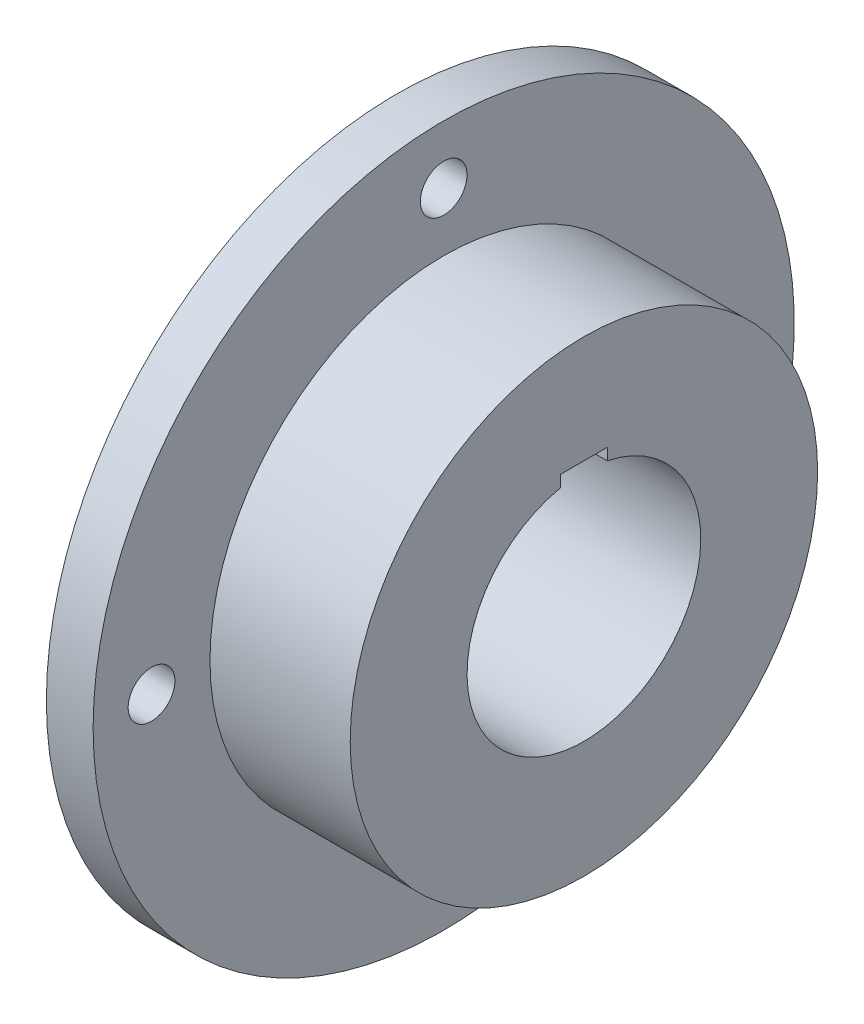
ISO-10303-21;
HEADER;
FILE_DESCRIPTION(('STEP AP214'),'2;1');
FILE_NAME('part.step','',(''),(''),'','','');
FILE_SCHEMA(('AUTOMOTIVE_DESIGN { 1 0 10303 214 1 1 1 1 }'));
ENDSEC;
DATA;
#1=APPLICATION_CONTEXT('core data for automotive mechanical design processes');
#2=APPLICATION_PROTOCOL_DEFINITION('international standard','automotive_design',2000,#1);
#3=PRODUCT_CONTEXT('',#1,'mechanical');
#4=PRODUCT('Part','Part','',(#3));
#5=PRODUCT_RELATED_PRODUCT_CATEGORY('part','',(#4));
#6=PRODUCT_DEFINITION_FORMATION('','',#4);
#7=PRODUCT_DEFINITION_CONTEXT('part definition',#1,'design');
#8=PRODUCT_DEFINITION('design','',#6,#7);
#9=PRODUCT_DEFINITION_SHAPE('','',#8);
#10=(LENGTH_UNIT() NAMED_UNIT(*) SI_UNIT(.MILLI.,.METRE.));
#11=(NAMED_UNIT(*) PLANE_ANGLE_UNIT() SI_UNIT($,.RADIAN.));
#12=(NAMED_UNIT(*) SI_UNIT($,.STERADIAN.) SOLID_ANGLE_UNIT());
#13=UNCERTAINTY_MEASURE_WITH_UNIT(LENGTH_MEASURE(1.E-05),#10,'distance_accuracy_value','');
#14=(GEOMETRIC_REPRESENTATION_CONTEXT(3) GLOBAL_UNCERTAINTY_ASSIGNED_CONTEXT((#13)) GLOBAL_UNIT_ASSIGNED_CONTEXT((#10,
#11,#12)) REPRESENTATION_CONTEXT('',''));
#15=CARTESIAN_POINT('',(0.,0.,0.));
#16=DIRECTION('',(0.,0.,1.));
#17=DIRECTION('',(1.,0.,0.));
#18=AXIS2_PLACEMENT_3D('',#15,#16,#17);
#19=CARTESIAN_POINT('',(7.,0.,0.));
#20=DIRECTION('',(-1.,0.,0.));
#21=DIRECTION('',(0.,0.,1.));
#22=AXIS2_PLACEMENT_3D('',#19,#20,#21);
#23=CYLINDRICAL_SURFACE('',#22,20.);
#24=CARTESIAN_POINT('',(7.,0.,0.));
#25=DIRECTION('',(1.,0.,0.));
#26=DIRECTION('',(0.,0.,-1.));
#27=AXIS2_PLACEMENT_3D('',#24,#25,#26);
#28=CIRCLE('',#27,20.);
#29=CARTESIAN_POINT('',(7.,0.,-20.));
#30=VERTEX_POINT('',#29);
#31=EDGE_CURVE('E43',#30,#30,#28,.T.);
#32=ORIENTED_EDGE('',*,*,#31,.F.);
#33=EDGE_LOOP('',(#32));
#34=FACE_BOUND('',#33,.T.);
#35=CARTESIAN_POINT('',(-5.,0.,0.));
#36=DIRECTION('',(-1.,0.,0.));
#37=DIRECTION('',(0.,0.,1.));
#38=AXIS2_PLACEMENT_3D('',#35,#36,#37);
#39=CIRCLE('',#38,20.);
#40=CARTESIAN_POINT('',(-5.,0.,20.));
#41=VERTEX_POINT('',#40);
#42=EDGE_CURVE('E11',#41,#41,#39,.T.);
#43=ORIENTED_EDGE('',*,*,#42,.F.);
#44=EDGE_LOOP('',(#43));
#45=FACE_BOUND('',#44,.T.);
#46=ADVANCED_FACE('F40',(#34,#45),#23,.T.);
#47=CARTESIAN_POINT('',(7.,0.,0.));
#48=DIRECTION('',(1.,0.,0.));
#49=DIRECTION('',(0.,0.,-1.));
#50=AXIS2_PLACEMENT_3D('',#47,#48,#49);
#51=PLANE('',#50);
#52=DIRECTION('',(0.,-1.,0.));
#53=VECTOR('',#52,1.);
#54=CARTESIAN_POINT('',(7.,0.,2.));
#55=LINE('',#54,#53);
#56=CARTESIAN_POINT('',(7.,10.7979589711327,2.));
#57=VERTEX_POINT('',#56);
#58=CARTESIAN_POINT('',(7.,9.79795897113271,2.));
#59=VERTEX_POINT('',#58);
#60=EDGE_CURVE('E79',#57,#59,#55,.T.);
#61=ORIENTED_EDGE('',*,*,#60,.F.);
#62=DIRECTION('',(0.,0.,1.));
#63=VECTOR('',#62,1.);
#64=CARTESIAN_POINT('',(7.,10.7979589711327,0.));
#65=LINE('',#64,#63);
#66=CARTESIAN_POINT('',(7.,10.7979589711327,-2.));
#67=VERTEX_POINT('',#66);
#68=EDGE_CURVE('E153',#67,#57,#65,.T.);
#69=ORIENTED_EDGE('',*,*,#68,.F.);
#70=DIRECTION('',(0.,-1.,0.));
#71=VECTOR('',#70,1.);
#72=CARTESIAN_POINT('',(7.,0.,-2.));
#73=LINE('',#72,#71);
#74=CARTESIAN_POINT('',(7.,9.79795897113271,-2.));
#75=VERTEX_POINT('',#74);
#76=EDGE_CURVE('E155',#67,#75,#73,.T.);
#77=ORIENTED_EDGE('',*,*,#76,.T.);
#78=CARTESIAN_POINT('',(7.,0.,0.));
#79=DIRECTION('',(1.,0.,0.));
#80=DIRECTION('',(0.,0.,-1.));
#81=AXIS2_PLACEMENT_3D('',#78,#79,#80);
#82=CIRCLE('',#81,10.);
#83=EDGE_CURVE('E99',#59,#75,#82,.T.);
#84=ORIENTED_EDGE('',*,*,#83,.F.);
#85=EDGE_LOOP('',(#61,#69,#77,#84));
#86=FACE_BOUND('',#85,.T.);
#87=ORIENTED_EDGE('',*,*,#31,.T.);
#88=EDGE_LOOP('',(#87));
#89=FACE_BOUND('',#88,.T.);
#90=ADVANCED_FACE('F121',(#86,#89),#51,.T.);
#91=CARTESIAN_POINT('',(7.,0.,0.));
#92=DIRECTION('',(-1.,0.,0.));
#93=DIRECTION('',(0.,0.,1.));
#94=AXIS2_PLACEMENT_3D('',#91,#92,#93);
#95=CYLINDRICAL_SURFACE('',#94,10.);
#96=DIRECTION('',(1.,0.,0.));
#97=VECTOR('',#96,1.);
#98=CARTESIAN_POINT('',(-9.,9.79795897113271,2.));
#99=LINE('',#98,#97);
#100=CARTESIAN_POINT('',(-9.,9.79795897113271,2.));
#101=VERTEX_POINT('',#100);
#102=EDGE_CURVE('E64',#101,#59,#99,.T.);
#103=ORIENTED_EDGE('',*,*,#102,.T.);
#104=ORIENTED_EDGE('',*,*,#83,.T.);
#105=DIRECTION('',(1.,0.,0.));
#106=VECTOR('',#105,1.);
#107=CARTESIAN_POINT('',(-9.,9.79795897113271,-2.));
#108=LINE('',#107,#106);
#109=CARTESIAN_POINT('',(-9.,9.79795897113271,-2.));
#110=VERTEX_POINT('',#109);
#111=EDGE_CURVE('E87',#110,#75,#108,.T.);
#112=ORIENTED_EDGE('',*,*,#111,.F.);
#113=CARTESIAN_POINT('',(-9.,0.,0.));
#114=DIRECTION('',(-1.,0.,0.));
#115=DIRECTION('',(0.,0.,1.));
#116=AXIS2_PLACEMENT_3D('',#113,#114,#115);
#117=CIRCLE('',#116,10.);
#118=EDGE_CURVE('E97',#110,#101,#117,.T.);
#119=ORIENTED_EDGE('',*,*,#118,.T.);
#120=EDGE_LOOP('',(#103,#104,#112,#119));
#121=FACE_BOUND('',#120,.T.);
#122=ADVANCED_FACE('F96',(#121),#95,.F.);
#123=CARTESIAN_POINT('',(-5.,0.,0.));
#124=DIRECTION('',(-1.,0.,0.));
#125=DIRECTION('',(0.,0.,1.));
#126=AXIS2_PLACEMENT_3D('',#123,#124,#125);
#127=PLANE('',#126);
#128=CARTESIAN_POINT('',(-5.,25.,0.));
#129=DIRECTION('',(1.,0.,0.));
#130=DIRECTION('',(0.,0.,-1.));
#131=AXIS2_PLACEMENT_3D('',#128,#129,#130);
#132=CIRCLE('',#131,2.);
#133=CARTESIAN_POINT('',(-5.,25.,-2.));
#134=VERTEX_POINT('',#133);
#135=EDGE_CURVE('E111',#134,#134,#132,.T.);
#136=ORIENTED_EDGE('',*,*,#135,.F.);
#137=EDGE_LOOP('',(#136));
#138=FACE_BOUND('',#137,.T.);
#139=CARTESIAN_POINT('',(-5.,0.,-25.));
#140=DIRECTION('',(1.,0.,0.));
#141=DIRECTION('',(0.,0.,-1.));
#142=AXIS2_PLACEMENT_3D('',#139,#140,#141);
#143=CIRCLE('',#142,2.);
#144=CARTESIAN_POINT('',(-5.,0.,-27.));
#145=VERTEX_POINT('',#144);
#146=EDGE_CURVE('E165',#145,#145,#143,.T.);
#147=ORIENTED_EDGE('',*,*,#146,.F.);
#148=EDGE_LOOP('',(#147));
#149=FACE_BOUND('',#148,.T.);
#150=CARTESIAN_POINT('',(-5.,-25.,1.74574066942157E-13));
#151=DIRECTION('',(1.,0.,0.));
#152=DIRECTION('',(0.,0.,-1.));
#153=AXIS2_PLACEMENT_3D('',#150,#151,#152);
#154=CIRCLE('',#153,2.);
#155=CARTESIAN_POINT('',(-5.,-25.,-1.99999999999983));
#156=VERTEX_POINT('',#155);
#157=EDGE_CURVE('E171',#156,#156,#154,.T.);
#158=ORIENTED_EDGE('',*,*,#157,.F.);
#159=EDGE_LOOP('',(#158));
#160=FACE_BOUND('',#159,.T.);
#161=CARTESIAN_POINT('',(-5.,2.61861100413235E-13,25.));
#162=DIRECTION('',(1.,0.,0.));
#163=DIRECTION('',(0.,0.,-1.));
#164=AXIS2_PLACEMENT_3D('',#161,#162,#163);
#165=CIRCLE('',#164,2.);
#166=CARTESIAN_POINT('',(-5.,2.61861100413235E-13,23.));
#167=VERTEX_POINT('',#166);
#168=EDGE_CURVE('E176',#167,#167,#165,.T.);
#169=ORIENTED_EDGE('',*,*,#168,.F.);
#170=EDGE_LOOP('',(#169));
#171=FACE_BOUND('',#170,.T.);
#172=CARTESIAN_POINT('',(-5.,0.,0.));
#173=DIRECTION('',(-1.,0.,0.));
#174=DIRECTION('',(0.,0.,1.));
#175=AXIS2_PLACEMENT_3D('',#172,#173,#174);
#176=CIRCLE('',#175,30.);
#177=CARTESIAN_POINT('',(-5.,0.,30.));
#178=VERTEX_POINT('',#177);
#179=EDGE_CURVE('E104',#178,#178,#176,.T.);
#180=ORIENTED_EDGE('',*,*,#179,.F.);
#181=EDGE_LOOP('',(#180));
#182=FACE_BOUND('',#181,.T.);
#183=ORIENTED_EDGE('',*,*,#42,.T.);
#184=EDGE_LOOP('',(#183));
#185=FACE_BOUND('',#184,.T.);
#186=ADVANCED_FACE('F127',(#138,#149,#160,#171,#182,#185),#127,.F.);
#187=CARTESIAN_POINT('',(-9.,0.,0.));
#188=DIRECTION('',(-1.,0.,0.));
#189=DIRECTION('',(0.,0.,1.));
#190=AXIS2_PLACEMENT_3D('',#187,#188,#189);
#191=PLANE('',#190);
#192=DIRECTION('',(0.,-1.,0.));
#193=VECTOR('',#192,1.);
#194=CARTESIAN_POINT('',(-9.,0.,2.));
#195=LINE('',#194,#193);
#196=CARTESIAN_POINT('',(-9.,10.7979589711327,2.));
#197=VERTEX_POINT('',#196);
#198=EDGE_CURVE('E100',#197,#101,#195,.T.);
#199=ORIENTED_EDGE('',*,*,#198,.T.);
#200=ORIENTED_EDGE('',*,*,#118,.F.);
#201=DIRECTION('',(0.,-1.,0.));
#202=VECTOR('',#201,1.);
#203=CARTESIAN_POINT('',(-9.,0.,-2.));
#204=LINE('',#203,#202);
#205=CARTESIAN_POINT('',(-9.,10.7979589711327,-2.));
#206=VERTEX_POINT('',#205);
#207=EDGE_CURVE('E83',#206,#110,#204,.T.);
#208=ORIENTED_EDGE('',*,*,#207,.F.);
#209=DIRECTION('',(0.,0.,1.));
#210=VECTOR('',#209,1.);
#211=CARTESIAN_POINT('',(-9.,10.7979589711327,0.));
#212=LINE('',#211,#210);
#213=EDGE_CURVE('E55',#206,#197,#212,.T.);
#214=ORIENTED_EDGE('',*,*,#213,.T.);
#215=EDGE_LOOP('',(#199,#200,#208,#214));
#216=FACE_BOUND('',#215,.T.);
#217=CARTESIAN_POINT('',(-9.,25.,0.));
#218=DIRECTION('',(1.,0.,0.));
#219=DIRECTION('',(0.,0.,-1.));
#220=AXIS2_PLACEMENT_3D('',#217,#218,#219);
#221=CIRCLE('',#220,2.);
#222=CARTESIAN_POINT('',(-9.,25.,-2.));
#223=VERTEX_POINT('',#222);
#224=EDGE_CURVE('E105',#223,#223,#221,.T.);
#225=ORIENTED_EDGE('',*,*,#224,.T.);
#226=EDGE_LOOP('',(#225));
#227=FACE_BOUND('',#226,.T.);
#228=CARTESIAN_POINT('',(-9.,0.,-25.));
#229=DIRECTION('',(1.,0.,0.));
#230=DIRECTION('',(0.,0.,-1.));
#231=AXIS2_PLACEMENT_3D('',#228,#229,#230);
#232=CIRCLE('',#231,2.);
#233=CARTESIAN_POINT('',(-9.,0.,-27.));
#234=VERTEX_POINT('',#233);
#235=EDGE_CURVE('E168',#234,#234,#232,.T.);
#236=ORIENTED_EDGE('',*,*,#235,.T.);
#237=EDGE_LOOP('',(#236));
#238=FACE_BOUND('',#237,.T.);
#239=CARTESIAN_POINT('',(-9.,-25.,1.74574066942157E-13));
#240=DIRECTION('',(1.,0.,0.));
#241=DIRECTION('',(0.,0.,-1.));
#242=AXIS2_PLACEMENT_3D('',#239,#240,#241);
#243=CIRCLE('',#242,2.);
#244=CARTESIAN_POINT('',(-9.,-25.,-1.99999999999983));
#245=VERTEX_POINT('',#244);
#246=EDGE_CURVE('E174',#245,#245,#243,.T.);
#247=ORIENTED_EDGE('',*,*,#246,.T.);
#248=EDGE_LOOP('',(#247));
#249=FACE_BOUND('',#248,.T.);
#250=CARTESIAN_POINT('',(-9.,2.61861100413235E-13,25.));
#251=DIRECTION('',(1.,0.,0.));
#252=DIRECTION('',(0.,0.,-1.));
#253=AXIS2_PLACEMENT_3D('',#250,#251,#252);
#254=CIRCLE('',#253,2.);
#255=CARTESIAN_POINT('',(-9.,2.61861100413235E-13,23.));
#256=VERTEX_POINT('',#255);
#257=EDGE_CURVE('E115',#256,#256,#254,.T.);
#258=ORIENTED_EDGE('',*,*,#257,.T.);
#259=EDGE_LOOP('',(#258));
#260=FACE_BOUND('',#259,.T.);
#261=CARTESIAN_POINT('',(-9.,0.,0.));
#262=DIRECTION('',(-1.,0.,0.));
#263=DIRECTION('',(0.,0.,1.));
#264=AXIS2_PLACEMENT_3D('',#261,#262,#263);
#265=CIRCLE('',#264,30.);
#266=CARTESIAN_POINT('',(-9.,0.,30.));
#267=VERTEX_POINT('',#266);
#268=EDGE_CURVE('E108',#267,#267,#265,.T.);
#269=ORIENTED_EDGE('',*,*,#268,.T.);
#270=EDGE_LOOP('',(#269));
#271=FACE_BOUND('',#270,.T.);
#272=ADVANCED_FACE('F102',(#216,#227,#238,#249,#260,#271),#191,.T.);
#273=CARTESIAN_POINT('',(-9.,0.,0.));
#274=DIRECTION('',(1.,0.,0.));
#275=DIRECTION('',(0.,0.,-1.));
#276=AXIS2_PLACEMENT_3D('',#273,#274,#275);
#277=CYLINDRICAL_SURFACE('',#276,30.);
#278=ORIENTED_EDGE('',*,*,#268,.F.);
#279=EDGE_LOOP('',(#278));
#280=FACE_BOUND('',#279,.T.);
#281=ORIENTED_EDGE('',*,*,#179,.T.);
#282=EDGE_LOOP('',(#281));
#283=FACE_BOUND('',#282,.T.);
#284=ADVANCED_FACE('F136',(#280,#283),#277,.T.);
#285=CARTESIAN_POINT('',(-9.,2.61861100413235E-13,25.));
#286=DIRECTION('',(1.,0.,0.));
#287=DIRECTION('',(0.,0.,-1.));
#288=AXIS2_PLACEMENT_3D('',#285,#286,#287);
#289=CYLINDRICAL_SURFACE('',#288,2.);
#290=ORIENTED_EDGE('',*,*,#257,.F.);
#291=EDGE_LOOP('',(#290));
#292=FACE_BOUND('',#291,.T.);
#293=ORIENTED_EDGE('',*,*,#168,.T.);
#294=EDGE_LOOP('',(#293));
#295=FACE_BOUND('',#294,.T.);
#296=ADVANCED_FACE('F144',(#292,#295),#289,.F.);
#297=CARTESIAN_POINT('',(-9.,-25.,1.74574066942157E-13));
#298=DIRECTION('',(1.,0.,0.));
#299=DIRECTION('',(0.,0.,-1.));
#300=AXIS2_PLACEMENT_3D('',#297,#298,#299);
#301=CYLINDRICAL_SURFACE('',#300,2.);
#302=ORIENTED_EDGE('',*,*,#246,.F.);
#303=EDGE_LOOP('',(#302));
#304=FACE_BOUND('',#303,.T.);
#305=ORIENTED_EDGE('',*,*,#157,.T.);
#306=EDGE_LOOP('',(#305));
#307=FACE_BOUND('',#306,.T.);
#308=ADVANCED_FACE('F185',(#304,#307),#301,.F.);
#309=CARTESIAN_POINT('',(-9.,0.,-25.));
#310=DIRECTION('',(1.,0.,0.));
#311=DIRECTION('',(0.,0.,-1.));
#312=AXIS2_PLACEMENT_3D('',#309,#310,#311);
#313=CYLINDRICAL_SURFACE('',#312,2.);
#314=ORIENTED_EDGE('',*,*,#235,.F.);
#315=EDGE_LOOP('',(#314));
#316=FACE_BOUND('',#315,.T.);
#317=ORIENTED_EDGE('',*,*,#146,.T.);
#318=EDGE_LOOP('',(#317));
#319=FACE_BOUND('',#318,.T.);
#320=ADVANCED_FACE('F189',(#316,#319),#313,.F.);
#321=CARTESIAN_POINT('',(-9.,25.,0.));
#322=DIRECTION('',(1.,0.,0.));
#323=DIRECTION('',(0.,0.,-1.));
#324=AXIS2_PLACEMENT_3D('',#321,#322,#323);
#325=CYLINDRICAL_SURFACE('',#324,2.);
#326=ORIENTED_EDGE('',*,*,#224,.F.);
#327=EDGE_LOOP('',(#326));
#328=FACE_BOUND('',#327,.T.);
#329=ORIENTED_EDGE('',*,*,#135,.T.);
#330=EDGE_LOOP('',(#329));
#331=FACE_BOUND('',#330,.T.);
#332=ADVANCED_FACE('F195',(#328,#331),#325,.F.);
#333=CARTESIAN_POINT('',(-9.,0.,2.));
#334=DIRECTION('',(0.,0.,1.));
#335=DIRECTION('',(0.,-1.,0.));
#336=AXIS2_PLACEMENT_3D('',#333,#334,#335);
#337=PLANE('',#336);
#338=ORIENTED_EDGE('',*,*,#60,.T.);
#339=ORIENTED_EDGE('',*,*,#102,.F.);
#340=ORIENTED_EDGE('',*,*,#198,.F.);
#341=DIRECTION('',(1.,0.,0.));
#342=VECTOR('',#341,1.);
#343=CARTESIAN_POINT('',(-9.,10.7979589711327,2.));
#344=LINE('',#343,#342);
#345=EDGE_CURVE('E160',#197,#57,#344,.T.);
#346=ORIENTED_EDGE('',*,*,#345,.T.);
#347=EDGE_LOOP('',(#338,#339,#340,#346));
#348=FACE_BOUND('',#347,.T.);
#349=ADVANCED_FACE('F198',(#348),#337,.F.);
#350=CARTESIAN_POINT('',(-9.,10.7979589711327,0.));
#351=DIRECTION('',(0.,1.,0.));
#352=DIRECTION('',(0.,0.,1.));
#353=AXIS2_PLACEMENT_3D('',#350,#351,#352);
#354=PLANE('',#353);
#355=ORIENTED_EDGE('',*,*,#68,.T.);
#356=ORIENTED_EDGE('',*,*,#345,.F.);
#357=ORIENTED_EDGE('',*,*,#213,.F.);
#358=DIRECTION('',(1.,0.,0.));
#359=VECTOR('',#358,1.);
#360=CARTESIAN_POINT('',(-9.,10.7979589711327,-2.));
#361=LINE('',#360,#359);
#362=EDGE_CURVE('E89',#206,#67,#361,.T.);
#363=ORIENTED_EDGE('',*,*,#362,.T.);
#364=EDGE_LOOP('',(#355,#356,#357,#363));
#365=FACE_BOUND('',#364,.T.);
#366=ADVANCED_FACE('F202',(#365),#354,.F.);
#367=CARTESIAN_POINT('',(-9.,0.,-2.));
#368=DIRECTION('',(0.,0.,1.));
#369=DIRECTION('',(0.,-1.,0.));
#370=AXIS2_PLACEMENT_3D('',#367,#368,#369);
#371=PLANE('',#370);
#372=ORIENTED_EDGE('',*,*,#76,.F.);
#373=ORIENTED_EDGE('',*,*,#362,.F.);
#374=ORIENTED_EDGE('',*,*,#207,.T.);
#375=ORIENTED_EDGE('',*,*,#111,.T.);
#376=EDGE_LOOP('',(#372,#373,#374,#375));
#377=FACE_BOUND('',#376,.T.);
#378=ADVANCED_FACE('F86',(#377),#371,.T.);
#379=CLOSED_SHELL('',(#46,#90,#122,#186,#272,#284,#296,#308,#320,#332,#349,#366,#378));
#380=MANIFOLD_SOLID_BREP('B2',#379);
#381=ADVANCED_BREP_SHAPE_REPRESENTATION('',(#18,#380),#14);
#382=SHAPE_DEFINITION_REPRESENTATION(#9,#381);
ENDSEC;
END-ISO-10303-21;
